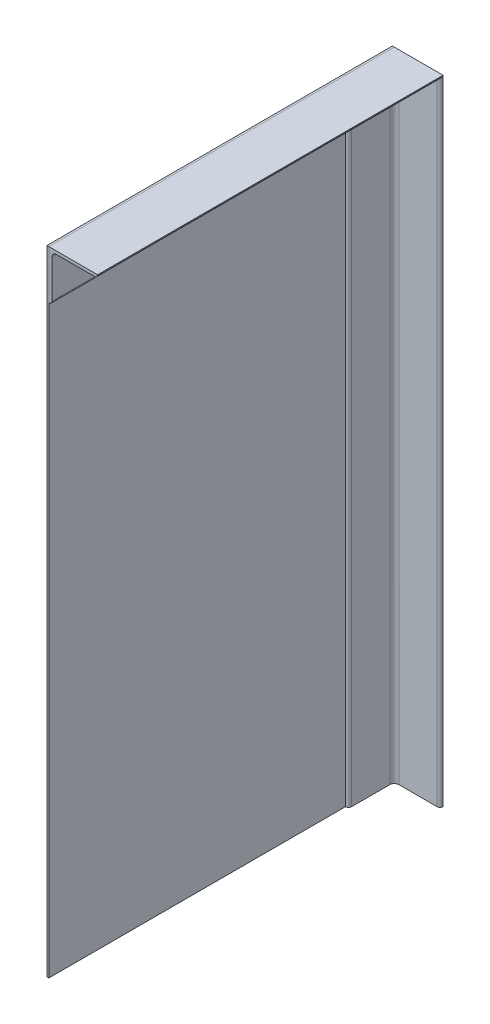
ISO-10303-21;
HEADER;
FILE_DESCRIPTION(('STEP AP214'),'2;1');
FILE_NAME('part.step','',(''),(''),'','','');
FILE_SCHEMA(('AUTOMOTIVE_DESIGN { 1 0 10303 214 1 1 1 1 }'));
ENDSEC;
DATA;
#1=APPLICATION_CONTEXT('core data for automotive mechanical design processes');
#2=APPLICATION_PROTOCOL_DEFINITION('international standard','automotive_design',2000,#1);
#3=PRODUCT_CONTEXT('',#1,'mechanical');
#4=PRODUCT('Part','Part','',(#3));
#5=PRODUCT_RELATED_PRODUCT_CATEGORY('part','',(#4));
#6=PRODUCT_DEFINITION_FORMATION('','',#4);
#7=PRODUCT_DEFINITION_CONTEXT('part definition',#1,'design');
#8=PRODUCT_DEFINITION('design','',#6,#7);
#9=PRODUCT_DEFINITION_SHAPE('','',#8);
#10=(LENGTH_UNIT() NAMED_UNIT(*) SI_UNIT(.MILLI.,.METRE.));
#11=(NAMED_UNIT(*) PLANE_ANGLE_UNIT() SI_UNIT($,.RADIAN.));
#12=(NAMED_UNIT(*) SI_UNIT($,.STERADIAN.) SOLID_ANGLE_UNIT());
#13=UNCERTAINTY_MEASURE_WITH_UNIT(LENGTH_MEASURE(1.E-05),#10,'distance_accuracy_value','');
#14=(GEOMETRIC_REPRESENTATION_CONTEXT(3) GLOBAL_UNCERTAINTY_ASSIGNED_CONTEXT((#13)) GLOBAL_UNIT_ASSIGNED_CONTEXT((#10,
#11,#12)) REPRESENTATION_CONTEXT('',''));
#15=CARTESIAN_POINT('',(0.,0.,0.));
#16=DIRECTION('',(0.,0.,1.));
#17=DIRECTION('',(1.,0.,0.));
#18=AXIS2_PLACEMENT_3D('',#15,#16,#17);
#19=CARTESIAN_POINT('',(-2.,0.,0.));
#20=DIRECTION('',(0.,0.,1.));
#21=DIRECTION('',(1.,0.,0.));
#22=AXIS2_PLACEMENT_3D('',#19,#20,#21);
#23=PLANE('',#22);
#24=DIRECTION('',(0.,-1.,0.));
#25=VECTOR('',#24,1.);
#26=CARTESIAN_POINT('',(0.,0.,0.));
#27=LINE('',#26,#25);
#28=CARTESIAN_POINT('',(0.,0.,0.));
#29=VERTEX_POINT('',#28);
#30=CARTESIAN_POINT('',(0.,-660.,0.));
#31=VERTEX_POINT('',#30);
#32=EDGE_CURVE('E143',#29,#31,#27,.T.);
#33=ORIENTED_EDGE('',*,*,#32,.T.);
#34=DIRECTION('',(1.,0.,0.));
#35=VECTOR('',#34,1.);
#36=CARTESIAN_POINT('',(-2.,-660.,0.));
#37=LINE('',#36,#35);
#38=CARTESIAN_POINT('',(-2.,-660.,0.));
#39=VERTEX_POINT('',#38);
#40=EDGE_CURVE('E14',#39,#31,#37,.T.);
#41=ORIENTED_EDGE('',*,*,#40,.F.);
#42=DIRECTION('',(0.,-1.,0.));
#43=VECTOR('',#42,1.);
#44=CARTESIAN_POINT('',(-2.,0.,0.));
#45=LINE('',#44,#43);
#46=CARTESIAN_POINT('',(-2.,0.,0.));
#47=VERTEX_POINT('',#46);
#48=EDGE_CURVE('E131',#47,#39,#45,.T.);
#49=ORIENTED_EDGE('',*,*,#48,.F.);
#50=DIRECTION('',(1.,0.,0.));
#51=VECTOR('',#50,1.);
#52=CARTESIAN_POINT('',(-2.,0.,0.));
#53=LINE('',#52,#51);
#54=EDGE_CURVE('E139',#47,#29,#53,.T.);
#55=ORIENTED_EDGE('',*,*,#54,.T.);
#56=EDGE_LOOP('',(#33,#41,#49,#55));
#57=FACE_BOUND('',#56,.T.);
#58=ADVANCED_FACE('F80',(#57),#23,.F.);
#59=CARTESIAN_POINT('',(-2.,-660.,0.));
#60=DIRECTION('',(0.,1.,0.));
#61=DIRECTION('',(0.,0.,1.));
#62=AXIS2_PLACEMENT_3D('',#59,#60,#61);
#63=PLANE('',#62);
#64=DIRECTION('',(0.,0.,1.));
#65=VECTOR('',#64,1.);
#66=CARTESIAN_POINT('',(0.,-660.,0.));
#67=LINE('',#66,#65);
#68=CARTESIAN_POINT('',(0.,-660.,360.));
#69=VERTEX_POINT('',#68);
#70=EDGE_CURVE('E135',#31,#69,#67,.T.);
#71=ORIENTED_EDGE('',*,*,#70,.T.);
#72=DIRECTION('',(1.,0.,0.));
#73=VECTOR('',#72,1.);
#74=CARTESIAN_POINT('',(-2.,-660.,360.));
#75=LINE('',#74,#73);
#76=CARTESIAN_POINT('',(-2.,-660.,360.));
#77=VERTEX_POINT('',#76);
#78=EDGE_CURVE('E88',#77,#69,#75,.T.);
#79=ORIENTED_EDGE('',*,*,#78,.F.);
#80=DIRECTION('',(0.,0.,1.));
#81=VECTOR('',#80,1.);
#82=CARTESIAN_POINT('',(-2.,-660.,0.));
#83=LINE('',#82,#81);
#84=EDGE_CURVE('E126',#39,#77,#83,.T.);
#85=ORIENTED_EDGE('',*,*,#84,.F.);
#86=ORIENTED_EDGE('',*,*,#40,.T.);
#87=EDGE_LOOP('',(#71,#79,#85,#86));
#88=FACE_BOUND('',#87,.T.);
#89=ADVANCED_FACE('F134',(#88),#63,.F.);
#90=CARTESIAN_POINT('',(-2.,0.,360.));
#91=DIRECTION('',(0.,0.,-1.));
#92=DIRECTION('',(-1.,0.,0.));
#93=AXIS2_PLACEMENT_3D('',#90,#91,#92);
#94=PLANE('',#93);
#95=DIRECTION('',(0.,1.,0.));
#96=VECTOR('',#95,1.);
#97=CARTESIAN_POINT('',(0.,0.,360.));
#98=LINE('',#97,#96);
#99=CARTESIAN_POINT('',(0.,0.,360.));
#100=VERTEX_POINT('',#99);
#101=EDGE_CURVE('E113',#69,#100,#98,.T.);
#102=ORIENTED_EDGE('',*,*,#101,.T.);
#103=DIRECTION('',(1.,0.,0.));
#104=VECTOR('',#103,1.);
#105=CARTESIAN_POINT('',(-2.,0.,360.));
#106=LINE('',#105,#104);
#107=CARTESIAN_POINT('',(-2.,0.,360.));
#108=VERTEX_POINT('',#107);
#109=EDGE_CURVE('E136',#108,#100,#106,.T.);
#110=ORIENTED_EDGE('',*,*,#109,.F.);
#111=DIRECTION('',(0.,1.,0.));
#112=VECTOR('',#111,1.);
#113=CARTESIAN_POINT('',(-2.,0.,360.));
#114=LINE('',#113,#112);
#115=EDGE_CURVE('E129',#77,#108,#114,.T.);
#116=ORIENTED_EDGE('',*,*,#115,.F.);
#117=ORIENTED_EDGE('',*,*,#78,.T.);
#118=EDGE_LOOP('',(#102,#110,#116,#117));
#119=FACE_BOUND('',#118,.T.);
#120=ADVANCED_FACE('F137',(#119),#94,.F.);
#121=CARTESIAN_POINT('',(-2.,0.,0.));
#122=DIRECTION('',(0.,-1.,0.));
#123=DIRECTION('',(0.,0.,-1.));
#124=AXIS2_PLACEMENT_3D('',#121,#122,#123);
#125=PLANE('',#124);
#126=DIRECTION('',(0.,0.,-1.));
#127=VECTOR('',#126,1.);
#128=CARTESIAN_POINT('',(0.,0.,0.));
#129=LINE('',#128,#127);
#130=EDGE_CURVE('E119',#100,#29,#129,.T.);
#131=ORIENTED_EDGE('',*,*,#130,.T.);
#132=ORIENTED_EDGE('',*,*,#54,.F.);
#133=DIRECTION('',(0.,0.,-1.));
#134=VECTOR('',#133,1.);
#135=CARTESIAN_POINT('',(-2.,0.,0.));
#136=LINE('',#135,#134);
#137=EDGE_CURVE('E96',#108,#47,#136,.T.);
#138=ORIENTED_EDGE('',*,*,#137,.F.);
#139=ORIENTED_EDGE('',*,*,#109,.T.);
#140=EDGE_LOOP('',(#131,#132,#138,#139));
#141=FACE_BOUND('',#140,.T.);
#142=ADVANCED_FACE('F150',(#141),#125,.F.);
#143=CARTESIAN_POINT('',(-2.,0.,0.));
#144=DIRECTION('',(-1.,0.,0.));
#145=DIRECTION('',(0.,0.,1.));
#146=AXIS2_PLACEMENT_3D('',#143,#144,#145);
#147=PLANE('',#146);
#148=ORIENTED_EDGE('',*,*,#48,.T.);
#149=ORIENTED_EDGE('',*,*,#84,.T.);
#150=ORIENTED_EDGE('',*,*,#115,.T.);
#151=ORIENTED_EDGE('',*,*,#137,.T.);
#152=EDGE_LOOP('',(#148,#149,#150,#151));
#153=FACE_BOUND('',#152,.T.);
#154=ADVANCED_FACE('F127',(#153),#147,.T.);
#155=CARTESIAN_POINT('',(0.,0.,0.));
#156=DIRECTION('',(-1.,0.,0.));
#157=DIRECTION('',(0.,0.,1.));
#158=AXIS2_PLACEMENT_3D('',#155,#156,#157);
#159=PLANE('',#158);
#160=ORIENTED_EDGE('',*,*,#32,.F.);
#161=ORIENTED_EDGE('',*,*,#130,.F.);
#162=ORIENTED_EDGE('',*,*,#101,.F.);
#163=ORIENTED_EDGE('',*,*,#70,.F.);
#164=EDGE_LOOP('',(#160,#161,#162,#163));
#165=FACE_BOUND('',#164,.T.);
#166=ADVANCED_FACE('F153',(#165),#159,.F.);
#167=CLOSED_SHELL('',(#58,#89,#120,#142,#154,#166));
#168=MANIFOLD_SOLID_BREP('B2',#167);
#169=CARTESIAN_POINT('',(0.,0.,50.8));
#170=DIRECTION('',(1.,0.,0.));
#171=DIRECTION('',(0.,0.,-1.));
#172=AXIS2_PLACEMENT_3D('',#169,#170,#171);
#173=PLANE('',#172);
#174=DIRECTION('',(0.,-0.707106781186548,0.707106781186547));
#175=VECTOR('',#174,1.);
#176=CARTESIAN_POINT('',(0.,-25.4,25.4));
#177=LINE('',#176,#175);
#178=CARTESIAN_POINT('',(0.,0.,0.));
#179=VERTEX_POINT('',#178);
#180=CARTESIAN_POINT('',(0.,-50.8,50.8));
#181=VERTEX_POINT('',#180);
#182=EDGE_CURVE('E322',#179,#181,#177,.T.);
#183=ORIENTED_EDGE('',*,*,#182,.F.);
#184=DIRECTION('',(0.,-1.,0.));
#185=VECTOR('',#184,1.);
#186=CARTESIAN_POINT('',(0.,0.,0.));
#187=LINE('',#186,#185);
#188=CARTESIAN_POINT('',(0.,-660.,0.));
#189=VERTEX_POINT('',#188);
#190=EDGE_CURVE('E218',#179,#189,#187,.T.);
#191=ORIENTED_EDGE('',*,*,#190,.T.);
#192=DIRECTION('',(0.,0.,1.));
#193=VECTOR('',#192,1.);
#194=CARTESIAN_POINT('',(0.,-660.,50.8));
#195=LINE('',#194,#193);
#196=CARTESIAN_POINT('',(0.,-660.,50.8));
#197=VERTEX_POINT('',#196);
#198=EDGE_CURVE('E330',#189,#197,#195,.T.);
#199=ORIENTED_EDGE('',*,*,#198,.T.);
#200=DIRECTION('',(0.,-1.,0.));
#201=VECTOR('',#200,1.);
#202=CARTESIAN_POINT('',(0.,0.,50.8));
#203=LINE('',#202,#201);
#204=EDGE_CURVE('E273',#181,#197,#203,.T.);
#205=ORIENTED_EDGE('',*,*,#204,.F.);
#206=EDGE_LOOP('',(#183,#191,#199,#205));
#207=FACE_BOUND('',#206,.T.);
#208=ADVANCED_FACE('F214',(#207),#173,.F.);
#209=CARTESIAN_POINT('',(0.00508,0.,50.8));
#210=DIRECTION('',(0.,0.,-1.));
#211=DIRECTION('',(-1.,0.,0.));
#212=AXIS2_PLACEMENT_3D('',#209,#210,#211);
#213=PLANE('',#212);
#214=DIRECTION('',(1.,0.,0.));
#215=VECTOR('',#214,1.);
#216=CARTESIAN_POINT('',(0.00508,-50.8,50.8));
#217=LINE('',#216,#215);
#218=CARTESIAN_POINT('',(0.00508,-50.8,50.8));
#219=VERTEX_POINT('',#218);
#220=EDGE_CURVE('E280',#181,#219,#217,.T.);
#221=ORIENTED_EDGE('',*,*,#220,.F.);
#222=ORIENTED_EDGE('',*,*,#204,.T.);
#223=DIRECTION('',(1.,0.,0.));
#224=VECTOR('',#223,1.);
#225=CARTESIAN_POINT('',(0.00508,-660.,50.8));
#226=LINE('',#225,#224);
#227=CARTESIAN_POINT('',(0.00508,-660.,50.8));
#228=VERTEX_POINT('',#227);
#229=EDGE_CURVE('E329',#197,#228,#226,.T.);
#230=ORIENTED_EDGE('',*,*,#229,.T.);
#231=DIRECTION('',(0.,-1.,0.));
#232=VECTOR('',#231,1.);
#233=CARTESIAN_POINT('',(0.00508,0.,50.8));
#234=LINE('',#233,#232);
#235=EDGE_CURVE('E331',#219,#228,#234,.T.);
#236=ORIENTED_EDGE('',*,*,#235,.F.);
#237=EDGE_LOOP('',(#221,#222,#230,#236));
#238=FACE_BOUND('',#237,.T.);
#239=ADVANCED_FACE('F365',(#238),#213,.F.);
#240=CARTESIAN_POINT('',(0.00507999999999961,0.,47.63008));
#241=DIRECTION('',(0.,-1.,0.));
#242=DIRECTION('',(0.,0.,-1.));
#243=AXIS2_PLACEMENT_3D('',#240,#241,#242);
#244=CYLINDRICAL_SURFACE('',#243,3.16992);
#245=CARTESIAN_POINT('',(0.00507999999999961,-47.63008,47.63008));
#246=DIRECTION('',(0.,0.707106781186547,0.707106781186548));
#247=DIRECTION('',(0.,-0.707106781186548,0.707106781186547));
#248=AXIS2_PLACEMENT_3D('',#245,#246,#247);
#249=ELLIPSE('',#248,4.48294385563772,3.16992);
#250=CARTESIAN_POINT('',(3.175,-47.63008,47.63008));
#251=VERTEX_POINT('',#250);
#252=EDGE_CURVE('E318',#219,#251,#249,.T.);
#253=ORIENTED_EDGE('',*,*,#252,.F.);
#254=ORIENTED_EDGE('',*,*,#235,.T.);
#255=CARTESIAN_POINT('',(0.00507999999999961,-660.,47.63008));
#256=DIRECTION('',(0.,1.,0.));
#257=DIRECTION('',(0.,0.,1.));
#258=AXIS2_PLACEMENT_3D('',#255,#256,#257);
#259=CIRCLE('',#258,3.16992);
#260=CARTESIAN_POINT('',(3.175,-660.,47.63008));
#261=VERTEX_POINT('',#260);
#262=EDGE_CURVE('E333',#228,#261,#259,.T.);
#263=ORIENTED_EDGE('',*,*,#262,.T.);
#264=DIRECTION('',(0.,-1.,0.));
#265=VECTOR('',#264,1.);
#266=CARTESIAN_POINT('',(3.175,0.,47.63008));
#267=LINE('',#266,#265);
#268=EDGE_CURVE('E334',#251,#261,#267,.T.);
#269=ORIENTED_EDGE('',*,*,#268,.F.);
#270=EDGE_LOOP('',(#253,#254,#263,#269));
#271=FACE_BOUND('',#270,.T.);
#272=ADVANCED_FACE('F368',(#271),#244,.T.);
#273=CARTESIAN_POINT('',(3.17499999999999,0.,7.93750000000001));
#274=DIRECTION('',(-1.,0.,0.));
#275=DIRECTION('',(0.,0.,1.));
#276=AXIS2_PLACEMENT_3D('',#273,#274,#275);
#277=PLANE('',#276);
#278=DIRECTION('',(0.,0.707106781186548,-0.707106781186547));
#279=VECTOR('',#278,1.);
#280=CARTESIAN_POINT('',(3.17499999999999,-3.96875000000001,3.96875000000001));
#281=LINE('',#280,#279);
#282=CARTESIAN_POINT('',(3.17499999999999,-7.93750000000002,7.93750000000002));
#283=VERTEX_POINT('',#282);
#284=EDGE_CURVE('E315',#251,#283,#281,.T.);
#285=ORIENTED_EDGE('',*,*,#284,.F.);
#286=ORIENTED_EDGE('',*,*,#268,.T.);
#287=DIRECTION('',(0.,0.,-1.));
#288=VECTOR('',#287,1.);
#289=CARTESIAN_POINT('',(3.17499999999999,-660.,7.93750000000001));
#290=LINE('',#289,#288);
#291=CARTESIAN_POINT('',(3.17499999999999,-660.,7.93750000000002));
#292=VERTEX_POINT('',#291);
#293=EDGE_CURVE('E336',#261,#292,#290,.T.);
#294=ORIENTED_EDGE('',*,*,#293,.T.);
#295=DIRECTION('',(0.,-1.,0.));
#296=VECTOR('',#295,1.);
#297=CARTESIAN_POINT('',(3.17499999999999,0.,7.93750000000002));
#298=LINE('',#297,#296);
#299=EDGE_CURVE('E337',#283,#292,#298,.T.);
#300=ORIENTED_EDGE('',*,*,#299,.F.);
#301=EDGE_LOOP('',(#285,#286,#294,#300));
#302=FACE_BOUND('',#301,.T.);
#303=ADVANCED_FACE('F370',(#302),#277,.F.);
#304=CARTESIAN_POINT('',(7.93749999999999,0.,7.93750000000001));
#305=DIRECTION('',(0.,-1.,0.));
#306=DIRECTION('',(0.,0.,-1.));
#307=AXIS2_PLACEMENT_3D('',#304,#305,#306);
#308=CYLINDRICAL_SURFACE('',#307,4.7625);
#309=CARTESIAN_POINT('',(7.93749999999999,-7.93750000000002,7.93750000000001));
#310=DIRECTION('',(0.,0.707106781186547,0.707106781186548));
#311=DIRECTION('',(0.,-0.707106781186548,0.707106781186547));
#312=AXIS2_PLACEMENT_3D('',#309,#310,#311);
#313=ELLIPSE('',#312,6.73519209080187,4.7625);
#314=CARTESIAN_POINT('',(7.93749999999999,-3.17500000000001,3.17500000000001));
#315=VERTEX_POINT('',#314);
#316=EDGE_CURVE('E310',#283,#315,#313,.F.);
#317=ORIENTED_EDGE('',*,*,#316,.F.);
#318=ORIENTED_EDGE('',*,*,#299,.T.);
#319=CARTESIAN_POINT('',(7.93749999999999,-660.,7.93750000000001));
#320=DIRECTION('',(0.,-1.,0.));
#321=DIRECTION('',(0.,0.,-1.));
#322=AXIS2_PLACEMENT_3D('',#319,#320,#321);
#323=CIRCLE('',#322,4.7625);
#324=CARTESIAN_POINT('',(7.93749999999999,-660.,3.17500000000001));
#325=VERTEX_POINT('',#324);
#326=EDGE_CURVE('E339',#292,#325,#323,.T.);
#327=ORIENTED_EDGE('',*,*,#326,.T.);
#328=DIRECTION('',(0.,-1.,0.));
#329=VECTOR('',#328,1.);
#330=CARTESIAN_POINT('',(7.93749999999999,0.,3.17500000000001));
#331=LINE('',#330,#329);
#332=EDGE_CURVE('E340',#315,#325,#331,.T.);
#333=ORIENTED_EDGE('',*,*,#332,.F.);
#334=EDGE_LOOP('',(#317,#318,#327,#333));
#335=FACE_BOUND('',#334,.T.);
#336=ADVANCED_FACE('F374',(#335),#308,.F.);
#337=CARTESIAN_POINT('',(47.63008,0.,3.175));
#338=DIRECTION('',(0.,0.,-1.));
#339=DIRECTION('',(-1.,0.,0.));
#340=AXIS2_PLACEMENT_3D('',#337,#338,#339);
#341=PLANE('',#340);
#342=DIRECTION('',(1.,0.,0.));
#343=VECTOR('',#342,1.);
#344=CARTESIAN_POINT('',(47.63008,-3.175,3.175));
#345=LINE('',#344,#343);
#346=CARTESIAN_POINT('',(47.63008,-3.175,3.175));
#347=VERTEX_POINT('',#346);
#348=EDGE_CURVE('E308',#315,#347,#345,.T.);
#349=ORIENTED_EDGE('',*,*,#348,.F.);
#350=ORIENTED_EDGE('',*,*,#332,.T.);
#351=DIRECTION('',(1.,0.,0.));
#352=VECTOR('',#351,1.);
#353=CARTESIAN_POINT('',(47.63008,-660.,3.175));
#354=LINE('',#353,#352);
#355=CARTESIAN_POINT('',(47.63008,-660.,3.175));
#356=VERTEX_POINT('',#355);
#357=EDGE_CURVE('E342',#325,#356,#354,.T.);
#358=ORIENTED_EDGE('',*,*,#357,.T.);
#359=DIRECTION('',(0.,-1.,0.));
#360=VECTOR('',#359,1.);
#361=CARTESIAN_POINT('',(47.63008,0.,3.175));
#362=LINE('',#361,#360);
#363=EDGE_CURVE('E343',#347,#356,#362,.T.);
#364=ORIENTED_EDGE('',*,*,#363,.F.);
#365=EDGE_LOOP('',(#349,#350,#358,#364));
#366=FACE_BOUND('',#365,.T.);
#367=ADVANCED_FACE('F378',(#366),#341,.F.);
#368=CARTESIAN_POINT('',(47.63008,0.,0.00508000000000019));
#369=DIRECTION('',(0.,-1.,0.));
#370=DIRECTION('',(0.,0.,-1.));
#371=AXIS2_PLACEMENT_3D('',#368,#369,#370);
#372=CYLINDRICAL_SURFACE('',#371,3.16992);
#373=CARTESIAN_POINT('',(47.63008,-0.0050800000000002,0.00508000000000019));
#374=DIRECTION('',(0.,0.707106781186547,0.707106781186548));
#375=DIRECTION('',(0.,-0.707106781186548,0.707106781186547));
#376=AXIS2_PLACEMENT_3D('',#373,#374,#375);
#377=ELLIPSE('',#376,4.48294385563772,3.16992);
#378=CARTESIAN_POINT('',(50.8,-0.00508,0.00508));
#379=VERTEX_POINT('',#378);
#380=EDGE_CURVE('E223',#347,#379,#377,.T.);
#381=ORIENTED_EDGE('',*,*,#380,.F.);
#382=ORIENTED_EDGE('',*,*,#363,.T.);
#383=CARTESIAN_POINT('',(47.63008,-660.,0.00508000000000019));
#384=DIRECTION('',(0.,1.,0.));
#385=DIRECTION('',(0.,0.,-1.));
#386=AXIS2_PLACEMENT_3D('',#383,#384,#385);
#387=CIRCLE('',#386,3.16992);
#388=CARTESIAN_POINT('',(50.8,-660.,0.00508));
#389=VERTEX_POINT('',#388);
#390=EDGE_CURVE('E302',#356,#389,#387,.T.);
#391=ORIENTED_EDGE('',*,*,#390,.T.);
#392=DIRECTION('',(0.,-1.,0.));
#393=VECTOR('',#392,1.);
#394=CARTESIAN_POINT('',(50.8,0.,0.00508));
#395=LINE('',#394,#393);
#396=EDGE_CURVE('E293',#379,#389,#395,.T.);
#397=ORIENTED_EDGE('',*,*,#396,.F.);
#398=EDGE_LOOP('',(#381,#382,#391,#397));
#399=FACE_BOUND('',#398,.T.);
#400=ADVANCED_FACE('F299',(#399),#372,.T.);
#401=CARTESIAN_POINT('',(50.8,0.,0.));
#402=DIRECTION('',(-1.,0.,0.));
#403=DIRECTION('',(0.,0.,1.));
#404=AXIS2_PLACEMENT_3D('',#401,#402,#403);
#405=PLANE('',#404);
#406=DIRECTION('',(0.,0.707106781186548,-0.707106781186547));
#407=VECTOR('',#406,1.);
#408=CARTESIAN_POINT('',(50.8,0.,0.));
#409=LINE('',#408,#407);
#410=CARTESIAN_POINT('',(50.8,0.,0.));
#411=VERTEX_POINT('',#410);
#412=EDGE_CURVE('E78',#379,#411,#409,.T.);
#413=ORIENTED_EDGE('',*,*,#412,.F.);
#414=ORIENTED_EDGE('',*,*,#396,.T.);
#415=DIRECTION('',(0.,0.,-1.));
#416=VECTOR('',#415,1.);
#417=CARTESIAN_POINT('',(50.8,-660.,0.));
#418=LINE('',#417,#416);
#419=CARTESIAN_POINT('',(50.8,-660.,0.));
#420=VERTEX_POINT('',#419);
#421=EDGE_CURVE('E304',#389,#420,#418,.T.);
#422=ORIENTED_EDGE('',*,*,#421,.T.);
#423=DIRECTION('',(0.,-1.,0.));
#424=VECTOR('',#423,1.);
#425=CARTESIAN_POINT('',(50.8,0.,0.));
#426=LINE('',#425,#424);
#427=EDGE_CURVE('E236',#411,#420,#426,.T.);
#428=ORIENTED_EDGE('',*,*,#427,.F.);
#429=EDGE_LOOP('',(#413,#414,#422,#428));
#430=FACE_BOUND('',#429,.T.);
#431=ADVANCED_FACE('F292',(#430),#405,.F.);
#432=CARTESIAN_POINT('',(0.,0.,0.));
#433=DIRECTION('',(0.,0.,1.));
#434=DIRECTION('',(1.,0.,0.));
#435=AXIS2_PLACEMENT_3D('',#432,#433,#434);
#436=PLANE('',#435);
#437=DIRECTION('',(-1.,0.,0.));
#438=VECTOR('',#437,1.);
#439=CARTESIAN_POINT('',(0.,0.,0.));
#440=LINE('',#439,#438);
#441=EDGE_CURVE('E325',#411,#179,#440,.T.);
#442=ORIENTED_EDGE('',*,*,#441,.F.);
#443=ORIENTED_EDGE('',*,*,#427,.T.);
#444=DIRECTION('',(-1.,0.,0.));
#445=VECTOR('',#444,1.);
#446=CARTESIAN_POINT('',(0.,-660.,0.));
#447=LINE('',#446,#445);
#448=EDGE_CURVE('E327',#420,#189,#447,.T.);
#449=ORIENTED_EDGE('',*,*,#448,.T.);
#450=ORIENTED_EDGE('',*,*,#190,.F.);
#451=EDGE_LOOP('',(#442,#443,#449,#450));
#452=FACE_BOUND('',#451,.T.);
#453=ADVANCED_FACE('F360',(#452),#436,.F.);
#454=CARTESIAN_POINT('',(47.63008,-660.,0.00508000000000019));
#455=DIRECTION('',(0.,-1.,0.));
#456=DIRECTION('',(0.,0.,-1.));
#457=AXIS2_PLACEMENT_3D('',#454,#455,#456);
#458=PLANE('',#457);
#459=ORIENTED_EDGE('',*,*,#198,.F.);
#460=ORIENTED_EDGE('',*,*,#448,.F.);
#461=ORIENTED_EDGE('',*,*,#421,.F.);
#462=ORIENTED_EDGE('',*,*,#390,.F.);
#463=ORIENTED_EDGE('',*,*,#357,.F.);
#464=ORIENTED_EDGE('',*,*,#326,.F.);
#465=ORIENTED_EDGE('',*,*,#293,.F.);
#466=ORIENTED_EDGE('',*,*,#262,.F.);
#467=ORIENTED_EDGE('',*,*,#229,.F.);
#468=EDGE_LOOP('',(#459,#460,#461,#462,#463,#464,#465,#466,#467));
#469=FACE_BOUND('',#468,.T.);
#470=ADVANCED_FACE('F362',(#469),#458,.T.);
#471=CARTESIAN_POINT('',(0.,0.,0.));
#472=DIRECTION('',(0.,0.707106781186547,0.707106781186548));
#473=DIRECTION('',(0.,-0.707106781186548,0.707106781186547));
#474=AXIS2_PLACEMENT_3D('',#471,#472,#473);
#475=PLANE('',#474);
#476=ORIENTED_EDGE('',*,*,#441,.T.);
#477=ORIENTED_EDGE('',*,*,#182,.T.);
#478=ORIENTED_EDGE('',*,*,#220,.T.);
#479=ORIENTED_EDGE('',*,*,#252,.T.);
#480=ORIENTED_EDGE('',*,*,#284,.T.);
#481=ORIENTED_EDGE('',*,*,#316,.T.);
#482=ORIENTED_EDGE('',*,*,#348,.T.);
#483=ORIENTED_EDGE('',*,*,#380,.T.);
#484=ORIENTED_EDGE('',*,*,#412,.T.);
#485=EDGE_LOOP('',(#476,#477,#478,#479,#480,#481,#482,#483,#484));
#486=FACE_BOUND('',#485,.T.);
#487=ADVANCED_FACE('F216',(#486),#475,.T.);
#488=CLOSED_SHELL('',(#208,#239,#272,#303,#336,#367,#400,#431,#453,#470,#487));
#489=MANIFOLD_SOLID_BREP('B8',#488);
#490=CARTESIAN_POINT('',(0.,-50.8,360.));
#491=DIRECTION('',(1.,0.,0.));
#492=DIRECTION('',(0.,0.,-1.));
#493=AXIS2_PLACEMENT_3D('',#490,#491,#492);
#494=PLANE('',#493);
#495=DIRECTION('',(0.,0.707106781186548,-0.707106781186547));
#496=VECTOR('',#495,1.);
#497=CARTESIAN_POINT('',(0.,-205.4,205.4));
#498=LINE('',#497,#496);
#499=CARTESIAN_POINT('',(0.,-50.8,50.8000000000001));
#500=VERTEX_POINT('',#499);
#501=CARTESIAN_POINT('',(0.,0.,1.66533453693773E-13));
#502=VERTEX_POINT('',#501);
#503=EDGE_CURVE('E607',#500,#502,#498,.T.);
#504=ORIENTED_EDGE('',*,*,#503,.F.);
#505=DIRECTION('',(0.,0.,-1.));
#506=VECTOR('',#505,1.);
#507=CARTESIAN_POINT('',(0.,-50.8,360.));
#508=LINE('',#507,#506);
#509=CARTESIAN_POINT('',(0.,-50.8,360.));
#510=VERTEX_POINT('',#509);
#511=EDGE_CURVE('E612',#510,#500,#508,.T.);
#512=ORIENTED_EDGE('',*,*,#511,.F.);
#513=DIRECTION('',(0.,-1.,0.));
#514=VECTOR('',#513,1.);
#515=CARTESIAN_POINT('',(0.,-50.8,360.));
#516=LINE('',#515,#514);
#517=CARTESIAN_POINT('',(0.,0.,360.));
#518=VERTEX_POINT('',#517);
#519=EDGE_CURVE('E599',#518,#510,#516,.T.);
#520=ORIENTED_EDGE('',*,*,#519,.F.);
#521=DIRECTION('',(0.,0.,-1.));
#522=VECTOR('',#521,1.);
#523=CARTESIAN_POINT('',(0.,0.,360.));
#524=LINE('',#523,#522);
#525=EDGE_CURVE('E508',#518,#502,#524,.T.);
#526=ORIENTED_EDGE('',*,*,#525,.T.);
#527=EDGE_LOOP('',(#504,#512,#520,#526));
#528=FACE_BOUND('',#527,.T.);
#529=ADVANCED_FACE('F504',(#528),#494,.F.);
#530=CARTESIAN_POINT('',(0.00508,-50.8,360.));
#531=DIRECTION('',(0.,1.,0.));
#532=DIRECTION('',(0.,0.,1.));
#533=AXIS2_PLACEMENT_3D('',#530,#531,#532);
#534=PLANE('',#533);
#535=DIRECTION('',(-1.,0.,0.));
#536=VECTOR('',#535,1.);
#537=CARTESIAN_POINT('',(0.00508,-50.8,50.8));
#538=LINE('',#537,#536);
#539=CARTESIAN_POINT('',(0.00508,-50.8,50.8));
#540=VERTEX_POINT('',#539);
#541=EDGE_CURVE('E562',#540,#500,#538,.T.);
#542=ORIENTED_EDGE('',*,*,#541,.F.);
#543=DIRECTION('',(0.,0.,-1.));
#544=VECTOR('',#543,1.);
#545=CARTESIAN_POINT('',(0.00508,-50.8,360.));
#546=LINE('',#545,#544);
#547=CARTESIAN_POINT('',(0.00508,-50.8,360.));
#548=VERTEX_POINT('',#547);
#549=EDGE_CURVE('E614',#548,#540,#546,.T.);
#550=ORIENTED_EDGE('',*,*,#549,.F.);
#551=DIRECTION('',(1.,0.,0.));
#552=VECTOR('',#551,1.);
#553=CARTESIAN_POINT('',(0.00508,-50.8,360.));
#554=LINE('',#553,#552);
#555=EDGE_CURVE('E554',#510,#548,#554,.T.);
#556=ORIENTED_EDGE('',*,*,#555,.F.);
#557=ORIENTED_EDGE('',*,*,#511,.T.);
#558=EDGE_LOOP('',(#542,#550,#556,#557));
#559=FACE_BOUND('',#558,.T.);
#560=ADVANCED_FACE('F665',(#559),#534,.F.);
#561=CARTESIAN_POINT('',(0.00507999999999961,-47.63008,360.));
#562=DIRECTION('',(0.,0.,-1.));
#563=DIRECTION('',(0.,1.,0.));
#564=AXIS2_PLACEMENT_3D('',#561,#562,#563);
#565=CYLINDRICAL_SURFACE('',#564,3.16992);
#566=CARTESIAN_POINT('',(0.00507999999999961,-47.63008,47.63008));
#567=DIRECTION('',(0.,-0.707106781186547,-0.707106781186548));
#568=DIRECTION('',(0.,0.707106781186548,-0.707106781186547));
#569=AXIS2_PLACEMENT_3D('',#566,#567,#568);
#570=ELLIPSE('',#569,4.48294385563772,3.16992);
#571=CARTESIAN_POINT('',(3.175,-47.63008,47.6300800000001));
#572=VERTEX_POINT('',#571);
#573=EDGE_CURVE('E212',#572,#540,#570,.T.);
#574=ORIENTED_EDGE('',*,*,#573,.F.);
#575=DIRECTION('',(0.,0.,-1.));
#576=VECTOR('',#575,1.);
#577=CARTESIAN_POINT('',(3.175,-47.63008,360.));
#578=LINE('',#577,#576);
#579=CARTESIAN_POINT('',(3.175,-47.63008,360.));
#580=VERTEX_POINT('',#579);
#581=EDGE_CURVE('E616',#580,#572,#578,.T.);
#582=ORIENTED_EDGE('',*,*,#581,.F.);
#583=CARTESIAN_POINT('',(0.00507999999999961,-47.63008,360.));
#584=DIRECTION('',(0.,0.,1.));
#585=DIRECTION('',(0.,-1.,0.));
#586=AXIS2_PLACEMENT_3D('',#583,#584,#585);
#587=CIRCLE('',#586,3.16992);
#588=EDGE_CURVE('E640',#548,#580,#587,.T.);
#589=ORIENTED_EDGE('',*,*,#588,.F.);
#590=ORIENTED_EDGE('',*,*,#549,.T.);
#591=EDGE_LOOP('',(#574,#582,#589,#590));
#592=FACE_BOUND('',#591,.T.);
#593=ADVANCED_FACE('F664',(#592),#565,.T.);
#594=CARTESIAN_POINT('',(3.17499999999999,-7.93750000000006,360.));
#595=DIRECTION('',(-1.,0.,0.));
#596=DIRECTION('',(0.,-1.,0.));
#597=AXIS2_PLACEMENT_3D('',#594,#595,#596);
#598=PLANE('',#597);
#599=DIRECTION('',(0.,-0.707106781186548,0.707106781186547));
#600=VECTOR('',#599,1.);
#601=CARTESIAN_POINT('',(3.17500000000002,-183.96875,183.96875));
#602=LINE('',#601,#600);
#603=CARTESIAN_POINT('',(3.17499999999999,-7.93750000000002,7.93750000000004));
#604=VERTEX_POINT('',#603);
#605=EDGE_CURVE('E514',#604,#572,#602,.T.);
#606=ORIENTED_EDGE('',*,*,#605,.F.);
#607=DIRECTION('',(0.,0.,-1.));
#608=VECTOR('',#607,1.);
#609=CARTESIAN_POINT('',(3.17499999999999,-7.93750000000006,360.));
#610=LINE('',#609,#608);
#611=CARTESIAN_POINT('',(3.17499999999999,-7.93750000000006,360.));
#612=VERTEX_POINT('',#611);
#613=EDGE_CURVE('E619',#612,#604,#610,.T.);
#614=ORIENTED_EDGE('',*,*,#613,.F.);
#615=DIRECTION('',(0.,1.,0.));
#616=VECTOR('',#615,1.);
#617=CARTESIAN_POINT('',(3.17499999999999,-7.93750000000006,360.));
#618=LINE('',#617,#616);
#619=EDGE_CURVE('E642',#580,#612,#618,.T.);
#620=ORIENTED_EDGE('',*,*,#619,.F.);
#621=ORIENTED_EDGE('',*,*,#581,.T.);
#622=EDGE_LOOP('',(#606,#614,#620,#621));
#623=FACE_BOUND('',#622,.T.);
#624=ADVANCED_FACE('F659',(#623),#598,.F.);
#625=CARTESIAN_POINT('',(7.93749999999999,-7.93750000000006,360.));
#626=DIRECTION('',(0.,0.,-1.));
#627=DIRECTION('',(0.,1.,0.));
#628=AXIS2_PLACEMENT_3D('',#625,#626,#627);
#629=CYLINDRICAL_SURFACE('',#628,4.7625);
#630=CARTESIAN_POINT('',(7.93749999999999,-7.93750000000001,7.93750000000004));
#631=DIRECTION('',(0.,-0.707106781186547,-0.707106781186548));
#632=DIRECTION('',(0.,0.707106781186548,-0.707106781186547));
#633=AXIS2_PLACEMENT_3D('',#630,#631,#632);
#634=ELLIPSE('',#633,6.73519209080187,4.7625);
#635=CARTESIAN_POINT('',(7.93749999999999,-3.17500000000001,3.17500000000009));
#636=VERTEX_POINT('',#635);
#637=EDGE_CURVE('E631',#636,#604,#634,.F.);
#638=ORIENTED_EDGE('',*,*,#637,.F.);
#639=DIRECTION('',(0.,0.,-1.));
#640=VECTOR('',#639,1.);
#641=CARTESIAN_POINT('',(7.93749999999999,-3.17500000000006,360.));
#642=LINE('',#641,#640);
#643=CARTESIAN_POINT('',(7.93749999999999,-3.17500000000006,360.));
#644=VERTEX_POINT('',#643);
#645=EDGE_CURVE('E622',#644,#636,#642,.T.);
#646=ORIENTED_EDGE('',*,*,#645,.F.);
#647=CARTESIAN_POINT('',(7.93749999999999,-7.93750000000006,360.));
#648=DIRECTION('',(0.,0.,-1.));
#649=DIRECTION('',(0.,1.,0.));
#650=AXIS2_PLACEMENT_3D('',#647,#648,#649);
#651=CIRCLE('',#650,4.7625);
#652=EDGE_CURVE('E644',#612,#644,#651,.T.);
#653=ORIENTED_EDGE('',*,*,#652,.F.);
#654=ORIENTED_EDGE('',*,*,#613,.T.);
#655=EDGE_LOOP('',(#638,#646,#653,#654));
#656=FACE_BOUND('',#655,.T.);
#657=ADVANCED_FACE('F656',(#656),#629,.F.);
#658=CARTESIAN_POINT('',(47.63008,-3.17500000000004,360.));
#659=DIRECTION('',(0.,1.,0.));
#660=DIRECTION('',(-1.,0.,0.));
#661=AXIS2_PLACEMENT_3D('',#658,#659,#660);
#662=PLANE('',#661);
#663=DIRECTION('',(-1.,0.,0.));
#664=VECTOR('',#663,1.);
#665=CARTESIAN_POINT('',(47.6300799999999,-3.175,3.17499999999998));
#666=LINE('',#665,#664);
#667=CARTESIAN_POINT('',(47.63008,-3.175,3.17499999999993));
#668=VERTEX_POINT('',#667);
#669=EDGE_CURVE('E579',#668,#636,#666,.T.);
#670=ORIENTED_EDGE('',*,*,#669,.F.);
#671=DIRECTION('',(0.,0.,-1.));
#672=VECTOR('',#671,1.);
#673=CARTESIAN_POINT('',(47.63008,-3.17500000000004,360.));
#674=LINE('',#673,#672);
#675=CARTESIAN_POINT('',(47.63008,-3.17500000000004,360.));
#676=VERTEX_POINT('',#675);
#677=EDGE_CURVE('E624',#676,#668,#674,.T.);
#678=ORIENTED_EDGE('',*,*,#677,.F.);
#679=DIRECTION('',(1.,0.,0.));
#680=VECTOR('',#679,1.);
#681=CARTESIAN_POINT('',(47.63008,-3.17500000000004,360.));
#682=LINE('',#681,#680);
#683=EDGE_CURVE('E646',#644,#676,#682,.T.);
#684=ORIENTED_EDGE('',*,*,#683,.F.);
#685=ORIENTED_EDGE('',*,*,#645,.T.);
#686=EDGE_LOOP('',(#670,#678,#684,#685));
#687=FACE_BOUND('',#686,.T.);
#688=ADVANCED_FACE('F654',(#687),#662,.F.);
#689=CARTESIAN_POINT('',(47.63008,-0.00508000000004428,360.));
#690=DIRECTION('',(0.,0.,-1.));
#691=DIRECTION('',(0.,1.,0.));
#692=AXIS2_PLACEMENT_3D('',#689,#690,#691);
#693=CYLINDRICAL_SURFACE('',#692,3.16992);
#694=CARTESIAN_POINT('',(47.63008,-0.0050800000000002,0.00507999999999065));
#695=DIRECTION('',(0.,-0.707106781186547,-0.707106781186548));
#696=DIRECTION('',(0.,0.707106781186548,-0.707106781186547));
#697=AXIS2_PLACEMENT_3D('',#694,#695,#696);
#698=ELLIPSE('',#697,4.48294385563772,3.16992);
#699=CARTESIAN_POINT('',(50.8,-0.00507999999999533,0.00508000000004616));
#700=VERTEX_POINT('',#699);
#701=EDGE_CURVE('E585',#700,#668,#698,.T.);
#702=ORIENTED_EDGE('',*,*,#701,.F.);
#703=DIRECTION('',(0.,0.,-1.));
#704=VECTOR('',#703,1.);
#705=CARTESIAN_POINT('',(50.8,-0.00508000000004409,360.));
#706=LINE('',#705,#704);
#707=CARTESIAN_POINT('',(50.8,-0.00508000000004409,360.));
#708=VERTEX_POINT('',#707);
#709=EDGE_CURVE('E600',#708,#700,#706,.T.);
#710=ORIENTED_EDGE('',*,*,#709,.F.);
#711=CARTESIAN_POINT('',(47.63008,-0.00508000000004428,360.));
#712=DIRECTION('',(0.,0.,1.));
#713=DIRECTION('',(0.,1.,0.));
#714=AXIS2_PLACEMENT_3D('',#711,#712,#713);
#715=CIRCLE('',#714,3.16992);
#716=EDGE_CURVE('E628',#676,#708,#715,.T.);
#717=ORIENTED_EDGE('',*,*,#716,.F.);
#718=ORIENTED_EDGE('',*,*,#677,.T.);
#719=EDGE_LOOP('',(#702,#710,#717,#718));
#720=FACE_BOUND('',#719,.T.);
#721=ADVANCED_FACE('F627',(#720),#693,.T.);
#722=CARTESIAN_POINT('',(50.8,0.,360.));
#723=DIRECTION('',(-1.,0.,0.));
#724=DIRECTION('',(0.,0.,1.));
#725=AXIS2_PLACEMENT_3D('',#722,#723,#724);
#726=PLANE('',#725);
#727=DIRECTION('',(0.,-0.707106781186548,0.707106781186547));
#728=VECTOR('',#727,1.);
#729=CARTESIAN_POINT('',(50.8,-180.,180.));
#730=LINE('',#729,#728);
#731=CARTESIAN_POINT('',(50.8,0.,0.));
#732=VERTEX_POINT('',#731);
#733=EDGE_CURVE('E602',#732,#700,#730,.T.);
#734=ORIENTED_EDGE('',*,*,#733,.F.);
#735=DIRECTION('',(0.,0.,-1.));
#736=VECTOR('',#735,1.);
#737=CARTESIAN_POINT('',(50.8,0.,360.));
#738=LINE('',#737,#736);
#739=CARTESIAN_POINT('',(50.8,0.,360.));
#740=VERTEX_POINT('',#739);
#741=EDGE_CURVE('E591',#740,#732,#738,.T.);
#742=ORIENTED_EDGE('',*,*,#741,.F.);
#743=DIRECTION('',(0.,1.,0.));
#744=VECTOR('',#743,1.);
#745=CARTESIAN_POINT('',(50.8,0.,360.));
#746=LINE('',#745,#744);
#747=EDGE_CURVE('E649',#708,#740,#746,.T.);
#748=ORIENTED_EDGE('',*,*,#747,.F.);
#749=ORIENTED_EDGE('',*,*,#709,.T.);
#750=EDGE_LOOP('',(#734,#742,#748,#749));
#751=FACE_BOUND('',#750,.T.);
#752=ADVANCED_FACE('F603',(#751),#726,.F.);
#753=CARTESIAN_POINT('',(0.,0.,360.));
#754=DIRECTION('',(0.,-1.,0.));
#755=DIRECTION('',(0.,0.,-1.));
#756=AXIS2_PLACEMENT_3D('',#753,#754,#755);
#757=PLANE('',#756);
#758=DIRECTION('',(1.,0.,0.));
#759=VECTOR('',#758,1.);
#760=CARTESIAN_POINT('',(0.,0.,0.));
#761=LINE('',#760,#759);
#762=EDGE_CURVE('E595',#502,#732,#761,.T.);
#763=ORIENTED_EDGE('',*,*,#762,.F.);
#764=ORIENTED_EDGE('',*,*,#525,.F.);
#765=DIRECTION('',(-1.,0.,0.));
#766=VECTOR('',#765,1.);
#767=CARTESIAN_POINT('',(0.,0.,360.));
#768=LINE('',#767,#766);
#769=EDGE_CURVE('E523',#740,#518,#768,.T.);
#770=ORIENTED_EDGE('',*,*,#769,.F.);
#771=ORIENTED_EDGE('',*,*,#741,.T.);
#772=EDGE_LOOP('',(#763,#764,#770,#771));
#773=FACE_BOUND('',#772,.T.);
#774=ADVANCED_FACE('F593',(#773),#757,.F.);
#775=CARTESIAN_POINT('',(47.63008,-0.00508000000004428,360.));
#776=DIRECTION('',(0.,0.,-1.));
#777=DIRECTION('',(0.,1.,0.));
#778=AXIS2_PLACEMENT_3D('',#775,#776,#777);
#779=PLANE('',#778);
#780=ORIENTED_EDGE('',*,*,#519,.T.);
#781=ORIENTED_EDGE('',*,*,#555,.T.);
#782=ORIENTED_EDGE('',*,*,#588,.T.);
#783=ORIENTED_EDGE('',*,*,#619,.T.);
#784=ORIENTED_EDGE('',*,*,#652,.T.);
#785=ORIENTED_EDGE('',*,*,#683,.T.);
#786=ORIENTED_EDGE('',*,*,#716,.T.);
#787=ORIENTED_EDGE('',*,*,#747,.T.);
#788=ORIENTED_EDGE('',*,*,#769,.T.);
#789=EDGE_LOOP('',(#780,#781,#782,#783,#784,#785,#786,#787,#788));
#790=FACE_BOUND('',#789,.T.);
#791=ADVANCED_FACE('F651',(#790),#779,.F.);
#792=CARTESIAN_POINT('',(0.,0.,0.));
#793=DIRECTION('',(0.,-0.707106781186547,-0.707106781186548));
#794=DIRECTION('',(0.,0.707106781186548,-0.707106781186547));
#795=AXIS2_PLACEMENT_3D('',#792,#793,#794);
#796=PLANE('',#795);
#797=ORIENTED_EDGE('',*,*,#541,.T.);
#798=ORIENTED_EDGE('',*,*,#503,.T.);
#799=ORIENTED_EDGE('',*,*,#762,.T.);
#800=ORIENTED_EDGE('',*,*,#733,.T.);
#801=ORIENTED_EDGE('',*,*,#701,.T.);
#802=ORIENTED_EDGE('',*,*,#669,.T.);
#803=ORIENTED_EDGE('',*,*,#637,.T.);
#804=ORIENTED_EDGE('',*,*,#605,.T.);
#805=ORIENTED_EDGE('',*,*,#573,.T.);
#806=EDGE_LOOP('',(#797,#798,#799,#800,#801,#802,#803,#804,#805));
#807=FACE_BOUND('',#806,.T.);
#808=ADVANCED_FACE('F506',(#807),#796,.T.);
#809=CLOSED_SHELL('',(#529,#560,#593,#624,#657,#688,#721,#752,#774,#791,#808));
#810=MANIFOLD_SOLID_BREP('B72',#809);
#811=ADVANCED_BREP_SHAPE_REPRESENTATION('',(#18,#168,#489,#810),#14);
#812=SHAPE_DEFINITION_REPRESENTATION(#9,#811);
ENDSEC;
END-ISO-10303-21;
